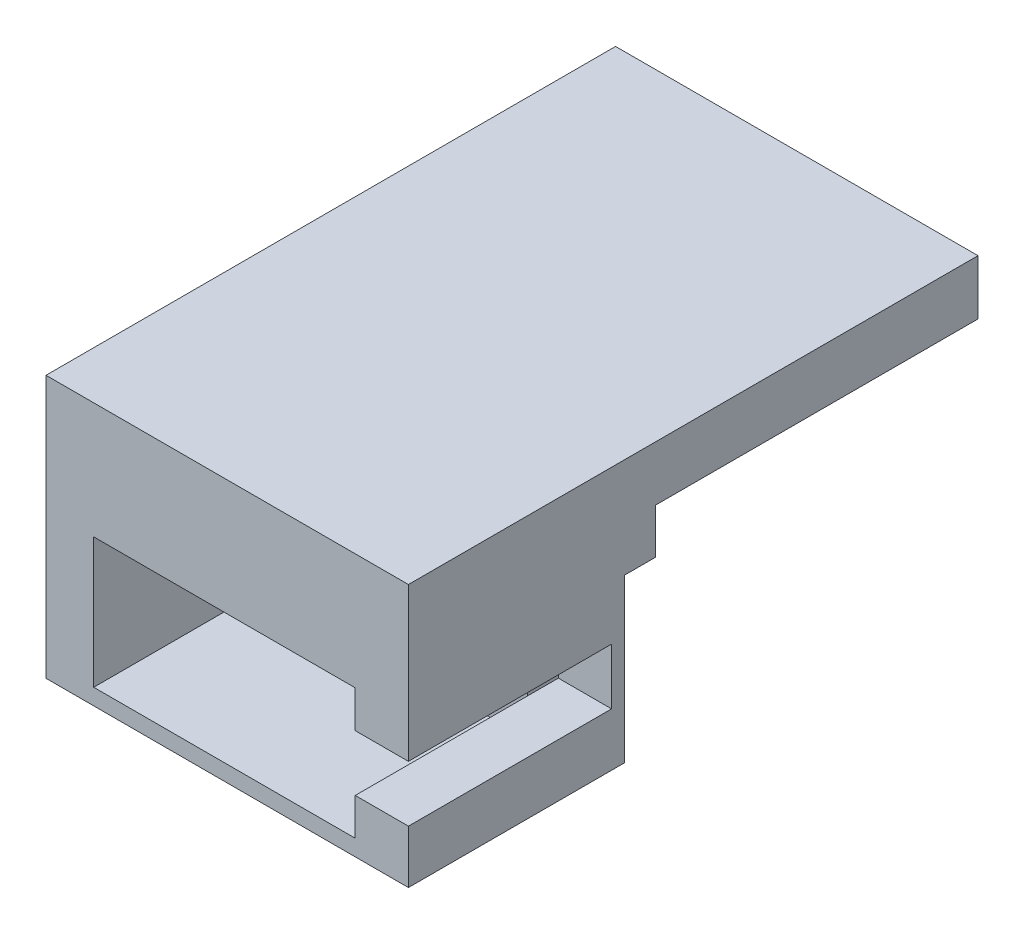
ISO-10303-21;
HEADER;
FILE_DESCRIPTION(('STEP AP214'),'2;1');
FILE_NAME('part.step','',(''),(''),'','','');
FILE_SCHEMA(('AUTOMOTIVE_DESIGN { 1 0 10303 214 1 1 1 1 }'));
ENDSEC;
DATA;
#1=APPLICATION_CONTEXT('core data for automotive mechanical design processes');
#2=APPLICATION_PROTOCOL_DEFINITION('international standard','automotive_design',2000,#1);
#3=PRODUCT_CONTEXT('',#1,'mechanical');
#4=PRODUCT('Part','Part','',(#3));
#5=PRODUCT_RELATED_PRODUCT_CATEGORY('part','',(#4));
#6=PRODUCT_DEFINITION_FORMATION('','',#4);
#7=PRODUCT_DEFINITION_CONTEXT('part definition',#1,'design');
#8=PRODUCT_DEFINITION('design','',#6,#7);
#9=PRODUCT_DEFINITION_SHAPE('','',#8);
#10=(LENGTH_UNIT() NAMED_UNIT(*) SI_UNIT(.MILLI.,.METRE.));
#11=(NAMED_UNIT(*) PLANE_ANGLE_UNIT() SI_UNIT($,.RADIAN.));
#12=(NAMED_UNIT(*) SI_UNIT($,.STERADIAN.) SOLID_ANGLE_UNIT());
#13=UNCERTAINTY_MEASURE_WITH_UNIT(LENGTH_MEASURE(1.E-05),#10,'distance_accuracy_value','');
#14=(GEOMETRIC_REPRESENTATION_CONTEXT(3) GLOBAL_UNCERTAINTY_ASSIGNED_CONTEXT((#13)) GLOBAL_UNIT_ASSIGNED_CONTEXT((#10,
#11,#12)) REPRESENTATION_CONTEXT('',''));
#15=CARTESIAN_POINT('',(0.,0.,0.));
#16=DIRECTION('',(0.,0.,1.));
#17=DIRECTION('',(1.,0.,0.));
#18=AXIS2_PLACEMENT_3D('',#15,#16,#17);
#19=CARTESIAN_POINT('',(-3.38414079582512,-1.3864385582846,31.5));
#20=DIRECTION('',(0.,1.,0.));
#21=DIRECTION('',(-1.,0.,0.));
#22=AXIS2_PLACEMENT_3D('',#19,#20,#21);
#23=PLANE('',#22);
#24=DIRECTION('',(0.,0.,-1.));
#25=VECTOR('',#24,1.);
#26=CARTESIAN_POINT('',(-3.38414079582512,-1.3864385582846,31.5));
#27=LINE('',#26,#25);
#28=CARTESIAN_POINT('',(-3.38414079582512,-1.3864385582846,31.5));
#29=VERTEX_POINT('',#28);
#30=CARTESIAN_POINT('',(-3.38414079582512,-1.3864385582846,-2.));
#31=VERTEX_POINT('',#30);
#32=EDGE_CURVE('E201',#29,#31,#27,.T.);
#33=ORIENTED_EDGE('',*,*,#32,.T.);
#34=DIRECTION('',(1.,0.,0.));
#35=VECTOR('',#34,1.);
#36=CARTESIAN_POINT('',(-3.38414079582512,-1.3864385582846,-2.));
#37=LINE('',#36,#35);
#38=CARTESIAN_POINT('',(52.8158592041749,-1.3864385582846,-2.));
#39=VERTEX_POINT('',#38);
#40=EDGE_CURVE('E285',#31,#39,#37,.T.);
#41=ORIENTED_EDGE('',*,*,#40,.T.);
#42=DIRECTION('',(0.,0.,-1.));
#43=VECTOR('',#42,1.);
#44=CARTESIAN_POINT('',(52.8158592041749,-1.3864385582846,31.5));
#45=LINE('',#44,#43);
#46=CARTESIAN_POINT('',(52.8158592041749,-1.3864385582846,31.5));
#47=VERTEX_POINT('',#46);
#48=EDGE_CURVE('E364',#47,#39,#45,.T.);
#49=ORIENTED_EDGE('',*,*,#48,.F.);
#50=DIRECTION('',(1.,0.,0.));
#51=VECTOR('',#50,1.);
#52=CARTESIAN_POINT('',(-3.38414079582512,-1.3864385582846,31.5));
#53=LINE('',#52,#51);
#54=EDGE_CURVE('E332',#29,#47,#53,.T.);
#55=ORIENTED_EDGE('',*,*,#54,.F.);
#56=EDGE_LOOP('',(#33,#41,#49,#55));
#57=FACE_BOUND('',#56,.T.);
#58=ADVANCED_FACE('F39',(#57),#23,.F.);
#59=CARTESIAN_POINT('',(44.5658592041749,6.8635614417154,31.5));
#60=DIRECTION('',(0.,-1.,0.));
#61=DIRECTION('',(0.,0.,-1.));
#62=AXIS2_PLACEMENT_3D('',#59,#60,#61);
#63=PLANE('',#62);
#64=DIRECTION('',(-1.,0.,0.));
#65=VECTOR('',#64,1.);
#66=CARTESIAN_POINT('',(44.5658592041749,6.8635614417154,0.));
#67=LINE('',#66,#65);
#68=CARTESIAN_POINT('',(52.8158592041749,6.8635614417154,0.));
#69=VERTEX_POINT('',#68);
#70=CARTESIAN_POINT('',(44.5658592041749,6.8635614417154,0.));
#71=VERTEX_POINT('',#70);
#72=EDGE_CURVE('E324',#69,#71,#67,.T.);
#73=ORIENTED_EDGE('',*,*,#72,.T.);
#74=DIRECTION('',(0.,0.,-1.));
#75=VECTOR('',#74,1.);
#76=CARTESIAN_POINT('',(44.5658592041749,6.8635614417154,31.5));
#77=LINE('',#76,#75);
#78=CARTESIAN_POINT('',(44.5658592041749,6.8635614417154,4.8));
#79=VERTEX_POINT('',#78);
#80=EDGE_CURVE('E358',#79,#71,#77,.T.);
#81=ORIENTED_EDGE('',*,*,#80,.F.);
#82=CARTESIAN_POINT('',(44.5658592041749,6.8635614417154,31.5));
#83=VERTEX_POINT('',#82);
#84=EDGE_CURVE('E359',#83,#79,#77,.T.);
#85=ORIENTED_EDGE('',*,*,#84,.F.);
#86=DIRECTION('',(-1.,0.,0.));
#87=VECTOR('',#86,1.);
#88=CARTESIAN_POINT('',(44.5658592041749,6.8635614417154,31.5));
#89=LINE('',#88,#87);
#90=CARTESIAN_POINT('',(52.8158592041749,6.8635614417154,31.5));
#91=VERTEX_POINT('',#90);
#92=EDGE_CURVE('E337',#91,#83,#89,.T.);
#93=ORIENTED_EDGE('',*,*,#92,.F.);
#94=DIRECTION('',(0.,0.,-1.));
#95=VECTOR('',#94,1.);
#96=CARTESIAN_POINT('',(52.8158592041749,6.8635614417154,31.5));
#97=LINE('',#96,#95);
#98=EDGE_CURVE('E361',#91,#69,#97,.T.);
#99=ORIENTED_EDGE('',*,*,#98,.T.);
#100=EDGE_LOOP('',(#73,#81,#85,#93,#99));
#101=FACE_BOUND('',#100,.T.);
#102=ADVANCED_FACE('F411',(#101),#63,.F.);
#103=CARTESIAN_POINT('',(44.5658592041749,15.5635614417154,31.5));
#104=DIRECTION('',(-1.,0.,0.));
#105=DIRECTION('',(0.,0.,1.));
#106=AXIS2_PLACEMENT_3D('',#103,#104,#105);
#107=PLANE('',#106);
#108=DIRECTION('',(0.,0.,-1.));
#109=VECTOR('',#108,1.);
#110=CARTESIAN_POINT('',(44.5658592041749,15.5635614417154,31.5));
#111=LINE('',#110,#109);
#112=CARTESIAN_POINT('',(44.5658592041749,15.5635614417154,4.8));
#113=VERTEX_POINT('',#112);
#114=CARTESIAN_POINT('',(44.5658592041749,15.5635614417154,0.));
#115=VERTEX_POINT('',#114);
#116=EDGE_CURVE('E354',#113,#115,#111,.T.);
#117=ORIENTED_EDGE('',*,*,#116,.F.);
#118=DIRECTION('',(0.,1.,0.));
#119=VECTOR('',#118,1.);
#120=CARTESIAN_POINT('',(44.5658592041749,6.8635614417154,4.8));
#121=LINE('',#120,#119);
#122=EDGE_CURVE('E310',#79,#113,#121,.T.);
#123=ORIENTED_EDGE('',*,*,#122,.F.);
#124=ORIENTED_EDGE('',*,*,#80,.T.);
#125=DIRECTION('',(0.,1.,0.));
#126=VECTOR('',#125,1.);
#127=CARTESIAN_POINT('',(44.5658592041749,15.5635614417154,0.));
#128=LINE('',#127,#126);
#129=EDGE_CURVE('E345',#71,#115,#128,.T.);
#130=ORIENTED_EDGE('',*,*,#129,.T.);
#131=EDGE_LOOP('',(#117,#123,#124,#130));
#132=FACE_BOUND('',#131,.T.);
#133=ADVANCED_FACE('F418',(#132),#107,.F.);
#134=CARTESIAN_POINT('',(52.8158592041749,15.5635614417154,31.5));
#135=DIRECTION('',(0.,1.,0.));
#136=DIRECTION('',(-1.,0.,0.));
#137=AXIS2_PLACEMENT_3D('',#134,#135,#136);
#138=PLANE('',#137);
#139=DIRECTION('',(1.,0.,0.));
#140=VECTOR('',#139,1.);
#141=CARTESIAN_POINT('',(52.8158592041749,15.5635614417154,0.));
#142=LINE('',#141,#140);
#143=CARTESIAN_POINT('',(52.8158592041749,15.5635614417154,0.));
#144=VERTEX_POINT('',#143);
#145=EDGE_CURVE('E335',#115,#144,#142,.T.);
#146=ORIENTED_EDGE('',*,*,#145,.T.);
#147=DIRECTION('',(0.,0.,-1.));
#148=VECTOR('',#147,1.);
#149=CARTESIAN_POINT('',(52.8158592041749,15.5635614417154,31.5));
#150=LINE('',#149,#148);
#151=CARTESIAN_POINT('',(52.8158592041749,15.5635614417154,31.5));
#152=VERTEX_POINT('',#151);
#153=EDGE_CURVE('E351',#152,#144,#150,.T.);
#154=ORIENTED_EDGE('',*,*,#153,.F.);
#155=DIRECTION('',(1.,0.,0.));
#156=VECTOR('',#155,1.);
#157=CARTESIAN_POINT('',(52.8158592041749,15.5635614417154,31.5));
#158=LINE('',#157,#156);
#159=CARTESIAN_POINT('',(44.5658592041749,15.5635614417154,31.5));
#160=VERTEX_POINT('',#159);
#161=EDGE_CURVE('E340',#160,#152,#158,.T.);
#162=ORIENTED_EDGE('',*,*,#161,.F.);
#163=EDGE_CURVE('E355',#160,#113,#111,.T.);
#164=ORIENTED_EDGE('',*,*,#163,.T.);
#165=ORIENTED_EDGE('',*,*,#116,.T.);
#166=EDGE_LOOP('',(#146,#154,#162,#164,#165));
#167=FACE_BOUND('',#166,.T.);
#168=ADVANCED_FACE('F424',(#167),#138,.F.);
#169=CARTESIAN_POINT('',(52.8158592041749,23.8135614417154,31.5));
#170=DIRECTION('',(-1.,0.,0.));
#171=DIRECTION('',(0.,0.,1.));
#172=AXIS2_PLACEMENT_3D('',#169,#170,#171);
#173=PLANE('',#172);
#174=ORIENTED_EDGE('',*,*,#153,.T.);
#175=DIRECTION('',(0.,1.,0.));
#176=VECTOR('',#175,1.);
#177=CARTESIAN_POINT('',(52.8158592041749,-1.3864385582846,0.));
#178=LINE('',#177,#176);
#179=EDGE_CURVE('E284',#69,#144,#178,.T.);
#180=ORIENTED_EDGE('',*,*,#179,.F.);
#181=ORIENTED_EDGE('',*,*,#98,.F.);
#182=DIRECTION('',(0.,1.,0.));
#183=VECTOR('',#182,1.);
#184=CARTESIAN_POINT('',(52.8158592041749,-1.3864385582846,31.5));
#185=LINE('',#184,#183);
#186=EDGE_CURVE('E334',#47,#91,#185,.T.);
#187=ORIENTED_EDGE('',*,*,#186,.F.);
#188=ORIENTED_EDGE('',*,*,#48,.T.);
#189=DIRECTION('',(0.,1.,0.));
#190=VECTOR('',#189,1.);
#191=CARTESIAN_POINT('',(52.8158592041749,-1.3864385582846,-2.));
#192=LINE('',#191,#190);
#193=CARTESIAN_POINT('',(52.8158592041749,23.8135614417154,-2.));
#194=VERTEX_POINT('',#193);
#195=EDGE_CURVE('E288',#39,#194,#192,.T.);
#196=ORIENTED_EDGE('',*,*,#195,.T.);
#197=DIRECTION('',(0.,0.,-1.));
#198=VECTOR('',#197,1.);
#199=CARTESIAN_POINT('',(52.8158592041749,23.8135614417154,13.1788546109846));
#200=LINE('',#199,#198);
#201=CARTESIAN_POINT('',(52.8158592041749,23.8135614417154,-6.82114538901544));
#202=VERTEX_POINT('',#201);
#203=EDGE_CURVE('E276',#194,#202,#200,.T.);
#204=ORIENTED_EDGE('',*,*,#203,.T.);
#205=DIRECTION('',(0.,-1.,0.));
#206=VECTOR('',#205,1.);
#207=CARTESIAN_POINT('',(52.8158592041749,30.8135614417154,-6.82114538901544));
#208=LINE('',#207,#206);
#209=CARTESIAN_POINT('',(52.8158592041749,30.8135614417154,-6.82114538901544));
#210=VERTEX_POINT('',#209);
#211=EDGE_CURVE('E281',#210,#202,#208,.T.);
#212=ORIENTED_EDGE('',*,*,#211,.F.);
#213=DIRECTION('',(0.,0.,-1.));
#214=VECTOR('',#213,1.);
#215=CARTESIAN_POINT('',(52.8158592041749,30.8135614417154,3.17885461098456));
#216=LINE('',#215,#214);
#217=CARTESIAN_POINT('',(52.8158592041749,30.8135614417154,-56.8211453890154));
#218=VERTEX_POINT('',#217);
#219=EDGE_CURVE('E254',#210,#218,#216,.T.);
#220=ORIENTED_EDGE('',*,*,#219,.T.);
#221=DIRECTION('',(0.,-1.,0.));
#222=VECTOR('',#221,1.);
#223=CARTESIAN_POINT('',(52.8158592041749,39.3135614417154,-56.8211453890154));
#224=LINE('',#223,#222);
#225=CARTESIAN_POINT('',(52.8158592041749,39.3135614417154,-56.8211453890154));
#226=VERTEX_POINT('',#225);
#227=EDGE_CURVE('E257',#226,#218,#224,.T.);
#228=ORIENTED_EDGE('',*,*,#227,.F.);
#229=DIRECTION('',(0.,0.,-1.));
#230=VECTOR('',#229,1.);
#231=CARTESIAN_POINT('',(52.8158592041749,39.3135614417154,3.17885461098456));
#232=LINE('',#231,#230);
#233=CARTESIAN_POINT('',(52.8158592041749,39.3135614417154,31.5));
#234=VERTEX_POINT('',#233);
#235=EDGE_CURVE('E215',#234,#226,#232,.T.);
#236=ORIENTED_EDGE('',*,*,#235,.F.);
#237=DIRECTION('',(0.,1.,0.));
#238=VECTOR('',#237,1.);
#239=CARTESIAN_POINT('',(52.8158592041749,23.8135614417154,31.5));
#240=LINE('',#239,#238);
#241=EDGE_CURVE('E206',#152,#234,#240,.T.);
#242=ORIENTED_EDGE('',*,*,#241,.F.);
#243=EDGE_LOOP('',(#174,#180,#181,#187,#188,#196,#204,#212,#220,#228,#236,#242));
#244=FACE_BOUND('',#243,.T.);
#245=ADVANCED_FACE('F428',(#244),#173,.F.);
#246=CARTESIAN_POINT('',(-3.38414079582512,-1.3864385582846,31.5));
#247=DIRECTION('',(1.,0.,0.));
#248=DIRECTION('',(0.,0.,-1.));
#249=AXIS2_PLACEMENT_3D('',#246,#247,#248);
#250=PLANE('',#249);
#251=DIRECTION('',(0.,-1.,0.));
#252=VECTOR('',#251,1.);
#253=CARTESIAN_POINT('',(-3.38414079582512,-1.3864385582846,31.5));
#254=LINE('',#253,#252);
#255=CARTESIAN_POINT('',(-3.38414079582512,39.3135614417154,31.5));
#256=VERTEX_POINT('',#255);
#257=EDGE_CURVE('E194',#256,#29,#254,.T.);
#258=ORIENTED_EDGE('',*,*,#257,.F.);
#259=DIRECTION('',(0.,0.,1.));
#260=VECTOR('',#259,1.);
#261=CARTESIAN_POINT('',(-3.38414079582513,39.3135614417154,-56.8211453890154));
#262=LINE('',#261,#260);
#263=CARTESIAN_POINT('',(-3.38414079582513,39.3135614417154,-56.8211453890154));
#264=VERTEX_POINT('',#263);
#265=EDGE_CURVE('E198',#264,#256,#262,.T.);
#266=ORIENTED_EDGE('',*,*,#265,.F.);
#267=DIRECTION('',(0.,-1.,0.));
#268=VECTOR('',#267,1.);
#269=CARTESIAN_POINT('',(-3.38414079582513,39.3135614417154,-56.8211453890154));
#270=LINE('',#269,#268);
#271=CARTESIAN_POINT('',(-3.38414079582513,30.8135614417154,-56.8211453890154));
#272=VERTEX_POINT('',#271);
#273=EDGE_CURVE('E266',#264,#272,#270,.T.);
#274=ORIENTED_EDGE('',*,*,#273,.T.);
#275=DIRECTION('',(0.,0.,1.));
#276=VECTOR('',#275,1.);
#277=CARTESIAN_POINT('',(-3.38414079582513,30.8135614417154,-56.8211453890154));
#278=LINE('',#277,#276);
#279=CARTESIAN_POINT('',(-3.38414079582512,30.8135614417154,-6.82114538901544));
#280=VERTEX_POINT('',#279);
#281=EDGE_CURVE('E260',#272,#280,#278,.T.);
#282=ORIENTED_EDGE('',*,*,#281,.T.);
#283=DIRECTION('',(0.,-1.,0.));
#284=VECTOR('',#283,1.);
#285=CARTESIAN_POINT('',(-3.38414079582512,30.8135614417154,-6.82114538901544));
#286=LINE('',#285,#284);
#287=CARTESIAN_POINT('',(-3.38414079582512,23.8135614417154,-6.82114538901544));
#288=VERTEX_POINT('',#287);
#289=EDGE_CURVE('E272',#280,#288,#286,.T.);
#290=ORIENTED_EDGE('',*,*,#289,.T.);
#291=DIRECTION('',(0.,0.,1.));
#292=VECTOR('',#291,1.);
#293=CARTESIAN_POINT('',(-3.38414079582512,23.8135614417154,-6.82114538901544));
#294=LINE('',#293,#292);
#295=CARTESIAN_POINT('',(-3.38414079582512,23.8135614417154,-2.));
#296=VERTEX_POINT('',#295);
#297=EDGE_CURVE('E268',#288,#296,#294,.T.);
#298=ORIENTED_EDGE('',*,*,#297,.T.);
#299=DIRECTION('',(0.,-1.,0.));
#300=VECTOR('',#299,1.);
#301=CARTESIAN_POINT('',(-3.38414079582512,23.8135614417154,-2.));
#302=LINE('',#301,#300);
#303=EDGE_CURVE('E294',#296,#31,#302,.T.);
#304=ORIENTED_EDGE('',*,*,#303,.T.);
#305=ORIENTED_EDGE('',*,*,#32,.F.);
#306=EDGE_LOOP('',(#258,#266,#274,#282,#290,#298,#304,#305));
#307=FACE_BOUND('',#306,.T.);
#308=ADVANCED_FACE('F196',(#307),#250,.F.);
#309=CARTESIAN_POINT('',(0.,0.,31.5));
#310=DIRECTION('',(0.,0.,1.));
#311=DIRECTION('',(1.,0.,0.));
#312=AXIS2_PLACEMENT_3D('',#309,#310,#311);
#313=PLANE('',#312);
#314=DIRECTION('',(0.,1.,0.));
#315=VECTOR('',#314,1.);
#316=CARTESIAN_POINT('',(44.5658592041749,0.,31.5));
#317=LINE('',#316,#315);
#318=CARTESIAN_POINT('',(44.5658592041749,21.3135614417154,31.5));
#319=VERTEX_POINT('',#318);
#320=EDGE_CURVE('E366',#160,#319,#317,.T.);
#321=ORIENTED_EDGE('',*,*,#320,.F.);
#322=ORIENTED_EDGE('',*,*,#161,.T.);
#323=ORIENTED_EDGE('',*,*,#241,.T.);
#324=DIRECTION('',(1.,0.,0.));
#325=VECTOR('',#324,1.);
#326=CARTESIAN_POINT('',(-3.38414079582512,39.3135614417154,31.5));
#327=LINE('',#326,#325);
#328=EDGE_CURVE('E211',#256,#234,#327,.T.);
#329=ORIENTED_EDGE('',*,*,#328,.F.);
#330=ORIENTED_EDGE('',*,*,#257,.T.);
#331=ORIENTED_EDGE('',*,*,#54,.T.);
#332=ORIENTED_EDGE('',*,*,#186,.T.);
#333=ORIENTED_EDGE('',*,*,#92,.T.);
#334=DIRECTION('',(0.,1.,0.));
#335=VECTOR('',#334,1.);
#336=CARTESIAN_POINT('',(44.5658592041749,21.3135614417154,31.5));
#337=LINE('',#336,#335);
#338=CARTESIAN_POINT('',(44.5658592041749,1.1135614417154,31.5));
#339=VERTEX_POINT('',#338);
#340=EDGE_CURVE('E318',#339,#83,#337,.T.);
#341=ORIENTED_EDGE('',*,*,#340,.F.);
#342=DIRECTION('',(1.,0.,0.));
#343=VECTOR('',#342,1.);
#344=CARTESIAN_POINT('',(44.5658592041749,1.1135614417154,31.5));
#345=LINE('',#344,#343);
#346=CARTESIAN_POINT('',(4.01585920417488,1.1135614417154,31.5));
#347=VERTEX_POINT('',#346);
#348=EDGE_CURVE('E315',#347,#339,#345,.T.);
#349=ORIENTED_EDGE('',*,*,#348,.F.);
#350=DIRECTION('',(0.,-1.,0.));
#351=VECTOR('',#350,1.);
#352=CARTESIAN_POINT('',(4.01585920417488,1.1135614417154,31.5));
#353=LINE('',#352,#351);
#354=CARTESIAN_POINT('',(4.01585920417488,21.3135614417154,31.5));
#355=VERTEX_POINT('',#354);
#356=EDGE_CURVE('E296',#355,#347,#353,.T.);
#357=ORIENTED_EDGE('',*,*,#356,.F.);
#358=DIRECTION('',(-1.,0.,0.));
#359=VECTOR('',#358,1.);
#360=CARTESIAN_POINT('',(4.01585920417488,21.3135614417154,31.5));
#361=LINE('',#360,#359);
#362=EDGE_CURVE('E302',#319,#355,#361,.T.);
#363=ORIENTED_EDGE('',*,*,#362,.F.);
#364=EDGE_LOOP('',(#321,#322,#323,#329,#330,#331,#332,#333,#341,#349,#357,#363));
#365=FACE_BOUND('',#364,.T.);
#366=ADVANCED_FACE('F218',(#365),#313,.T.);
#367=CARTESIAN_POINT('',(44.5658592041749,21.3135614417154,4.8));
#368=DIRECTION('',(1.,0.,0.));
#369=DIRECTION('',(0.,0.,-1.));
#370=AXIS2_PLACEMENT_3D('',#367,#368,#369);
#371=PLANE('',#370);
#372=CARTESIAN_POINT('',(44.5658592041749,1.1135614417154,4.8));
#373=VERTEX_POINT('',#372);
#374=EDGE_CURVE('E306',#373,#79,#121,.T.);
#375=ORIENTED_EDGE('',*,*,#374,.F.);
#376=DIRECTION('',(0.,0.,1.));
#377=VECTOR('',#376,1.);
#378=CARTESIAN_POINT('',(44.5658592041749,1.1135614417154,4.8));
#379=LINE('',#378,#377);
#380=EDGE_CURVE('E328',#373,#339,#379,.T.);
#381=ORIENTED_EDGE('',*,*,#380,.T.);
#382=ORIENTED_EDGE('',*,*,#340,.T.);
#383=ORIENTED_EDGE('',*,*,#84,.T.);
#384=EDGE_LOOP('',(#375,#381,#382,#383));
#385=FACE_BOUND('',#384,.T.);
#386=ADVANCED_FACE('F437',(#385),#371,.F.);
#387=ORIENTED_EDGE('',*,*,#320,.T.);
#388=DIRECTION('',(0.,0.,1.));
#389=VECTOR('',#388,1.);
#390=CARTESIAN_POINT('',(44.5658592041749,21.3135614417154,4.8));
#391=LINE('',#390,#389);
#392=CARTESIAN_POINT('',(44.5658592041749,21.3135614417154,4.8));
#393=VERTEX_POINT('',#392);
#394=EDGE_CURVE('E325',#393,#319,#391,.T.);
#395=ORIENTED_EDGE('',*,*,#394,.F.);
#396=EDGE_CURVE('E305',#113,#393,#121,.T.);
#397=ORIENTED_EDGE('',*,*,#396,.F.);
#398=ORIENTED_EDGE('',*,*,#163,.F.);
#399=EDGE_LOOP('',(#387,#395,#397,#398));
#400=FACE_BOUND('',#399,.T.);
#401=ADVANCED_FACE('F442',(#400),#371,.F.);
#402=CARTESIAN_POINT('',(4.01585920417488,1.1135614417154,4.8));
#403=DIRECTION('',(-1.,0.,0.));
#404=DIRECTION('',(0.,-1.,0.));
#405=AXIS2_PLACEMENT_3D('',#402,#403,#404);
#406=PLANE('',#405);
#407=ORIENTED_EDGE('',*,*,#356,.T.);
#408=DIRECTION('',(0.,0.,1.));
#409=VECTOR('',#408,1.);
#410=CARTESIAN_POINT('',(4.01585920417488,1.1135614417154,4.8));
#411=LINE('',#410,#409);
#412=CARTESIAN_POINT('',(4.01585920417488,1.1135614417154,4.8));
#413=VERTEX_POINT('',#412);
#414=EDGE_CURVE('E313',#413,#347,#411,.T.);
#415=ORIENTED_EDGE('',*,*,#414,.F.);
#416=DIRECTION('',(0.,-1.,0.));
#417=VECTOR('',#416,1.);
#418=CARTESIAN_POINT('',(4.01585920417488,1.1135614417154,4.8));
#419=LINE('',#418,#417);
#420=CARTESIAN_POINT('',(4.01585920417488,21.3135614417154,4.8));
#421=VERTEX_POINT('',#420);
#422=EDGE_CURVE('E298',#421,#413,#419,.T.);
#423=ORIENTED_EDGE('',*,*,#422,.F.);
#424=DIRECTION('',(0.,0.,1.));
#425=VECTOR('',#424,1.);
#426=CARTESIAN_POINT('',(4.01585920417488,21.3135614417154,4.8));
#427=LINE('',#426,#425);
#428=EDGE_CURVE('E322',#421,#355,#427,.T.);
#429=ORIENTED_EDGE('',*,*,#428,.T.);
#430=EDGE_LOOP('',(#407,#415,#423,#429));
#431=FACE_BOUND('',#430,.T.);
#432=ADVANCED_FACE('F438',(#431),#406,.F.);
#433=CARTESIAN_POINT('',(4.01585920417488,21.3135614417154,4.8));
#434=DIRECTION('',(0.,1.,0.));
#435=DIRECTION('',(0.,0.,1.));
#436=AXIS2_PLACEMENT_3D('',#433,#434,#435);
#437=PLANE('',#436);
#438=ORIENTED_EDGE('',*,*,#362,.T.);
#439=ORIENTED_EDGE('',*,*,#428,.F.);
#440=DIRECTION('',(-1.,0.,0.));
#441=VECTOR('',#440,1.);
#442=CARTESIAN_POINT('',(4.01585920417488,21.3135614417154,4.8));
#443=LINE('',#442,#441);
#444=EDGE_CURVE('E309',#393,#421,#443,.T.);
#445=ORIENTED_EDGE('',*,*,#444,.F.);
#446=ORIENTED_EDGE('',*,*,#394,.T.);
#447=EDGE_LOOP('',(#438,#439,#445,#446));
#448=FACE_BOUND('',#447,.T.);
#449=ADVANCED_FACE('F441',(#448),#437,.F.);
#450=CARTESIAN_POINT('',(44.5658592041749,1.1135614417154,4.8));
#451=DIRECTION('',(0.,-1.,0.));
#452=DIRECTION('',(1.,0.,0.));
#453=AXIS2_PLACEMENT_3D('',#450,#451,#452);
#454=PLANE('',#453);
#455=ORIENTED_EDGE('',*,*,#348,.T.);
#456=ORIENTED_EDGE('',*,*,#380,.F.);
#457=DIRECTION('',(1.,0.,0.));
#458=VECTOR('',#457,1.);
#459=CARTESIAN_POINT('',(44.5658592041749,1.1135614417154,4.8));
#460=LINE('',#459,#458);
#461=EDGE_CURVE('E301',#413,#373,#460,.T.);
#462=ORIENTED_EDGE('',*,*,#461,.F.);
#463=ORIENTED_EDGE('',*,*,#414,.T.);
#464=EDGE_LOOP('',(#455,#456,#462,#463));
#465=FACE_BOUND('',#464,.T.);
#466=ADVANCED_FACE('F444',(#465),#454,.F.);
#467=CARTESIAN_POINT('',(0.,0.,4.8));
#468=DIRECTION('',(0.,0.,-1.));
#469=DIRECTION('',(-1.,0.,0.));
#470=AXIS2_PLACEMENT_3D('',#467,#468,#469);
#471=PLANE('',#470);
#472=ORIENTED_EDGE('',*,*,#422,.T.);
#473=ORIENTED_EDGE('',*,*,#461,.T.);
#474=ORIENTED_EDGE('',*,*,#374,.T.);
#475=ORIENTED_EDGE('',*,*,#122,.T.);
#476=ORIENTED_EDGE('',*,*,#396,.T.);
#477=ORIENTED_EDGE('',*,*,#444,.T.);
#478=EDGE_LOOP('',(#472,#473,#474,#475,#476,#477));
#479=FACE_BOUND('',#478,.T.);
#480=ADVANCED_FACE('F447',(#479),#471,.F.);
#481=CARTESIAN_POINT('',(0.,0.,0.));
#482=DIRECTION('',(0.,0.,1.));
#483=DIRECTION('',(1.,0.,0.));
#484=AXIS2_PLACEMENT_3D('',#481,#482,#483);
#485=PLANE('',#484);
#486=ORIENTED_EDGE('',*,*,#145,.F.);
#487=ORIENTED_EDGE('',*,*,#129,.F.);
#488=ORIENTED_EDGE('',*,*,#72,.F.);
#489=ORIENTED_EDGE('',*,*,#179,.T.);
#490=EDGE_LOOP('',(#486,#487,#488,#489));
#491=FACE_BOUND('',#490,.T.);
#492=ADVANCED_FACE('F456',(#491),#485,.T.);
#493=CARTESIAN_POINT('',(0.,0.,-2.));
#494=DIRECTION('',(0.,0.,1.));
#495=DIRECTION('',(1.,0.,0.));
#496=AXIS2_PLACEMENT_3D('',#493,#494,#495);
#497=PLANE('',#496);
#498=ORIENTED_EDGE('',*,*,#40,.F.);
#499=ORIENTED_EDGE('',*,*,#303,.F.);
#500=DIRECTION('',(-1.,0.,0.));
#501=VECTOR('',#500,1.);
#502=CARTESIAN_POINT('',(52.8158592041749,23.8135614417154,-2.));
#503=LINE('',#502,#501);
#504=EDGE_CURVE('E291',#194,#296,#503,.T.);
#505=ORIENTED_EDGE('',*,*,#504,.F.);
#506=ORIENTED_EDGE('',*,*,#195,.F.);
#507=EDGE_LOOP('',(#498,#499,#505,#506));
#508=FACE_BOUND('',#507,.T.);
#509=ADVANCED_FACE('F460',(#508),#497,.F.);
#510=CARTESIAN_POINT('',(0.,23.8135614417154,0.));
#511=DIRECTION('',(0.,1.,0.));
#512=DIRECTION('',(0.,0.,1.));
#513=AXIS2_PLACEMENT_3D('',#510,#511,#512);
#514=PLANE('',#513);
#515=ORIENTED_EDGE('',*,*,#203,.F.);
#516=ORIENTED_EDGE('',*,*,#504,.T.);
#517=ORIENTED_EDGE('',*,*,#297,.F.);
#518=DIRECTION('',(-1.,0.,0.));
#519=VECTOR('',#518,1.);
#520=CARTESIAN_POINT('',(52.8158592041749,23.8135614417154,-6.82114538901544));
#521=LINE('',#520,#519);
#522=EDGE_CURVE('E273',#202,#288,#521,.T.);
#523=ORIENTED_EDGE('',*,*,#522,.F.);
#524=EDGE_LOOP('',(#515,#516,#517,#523));
#525=FACE_BOUND('',#524,.T.);
#526=ADVANCED_FACE('F464',(#525),#514,.F.);
#527=CARTESIAN_POINT('',(52.8158592041749,30.8135614417154,-6.82114538901544));
#528=DIRECTION('',(0.,0.,1.));
#529=DIRECTION('',(1.,0.,0.));
#530=AXIS2_PLACEMENT_3D('',#527,#528,#529);
#531=PLANE('',#530);
#532=ORIENTED_EDGE('',*,*,#522,.T.);
#533=ORIENTED_EDGE('',*,*,#289,.F.);
#534=DIRECTION('',(-1.,0.,0.));
#535=VECTOR('',#534,1.);
#536=CARTESIAN_POINT('',(52.8158592041749,30.8135614417154,-6.82114538901544));
#537=LINE('',#536,#535);
#538=EDGE_CURVE('E269',#210,#280,#537,.T.);
#539=ORIENTED_EDGE('',*,*,#538,.F.);
#540=ORIENTED_EDGE('',*,*,#211,.T.);
#541=EDGE_LOOP('',(#532,#533,#539,#540));
#542=FACE_BOUND('',#541,.T.);
#543=ADVANCED_FACE('F466',(#542),#531,.F.);
#544=CARTESIAN_POINT('',(0.,30.8135614417154,0.));
#545=DIRECTION('',(0.,1.,0.));
#546=DIRECTION('',(0.,0.,1.));
#547=AXIS2_PLACEMENT_3D('',#544,#545,#546);
#548=PLANE('',#547);
#549=CARTESIAN_POINT('',(22.3405072549363,30.8135614417154,-44.7479400444345));
#550=DIRECTION('',(0.,-1.,0.));
#551=DIRECTION('',(0.,0.,-1.));
#552=AXIS2_PLACEMENT_3D('',#549,#550,#551);
#553=CIRCLE('',#552,7.6);
#554=CARTESIAN_POINT('',(27.7797912177125,30.8135614417154,-39.440003536498));
#555=VERTEX_POINT('',#554);
#556=CARTESIAN_POINT('',(27.7797912177125,30.8135614417154,-50.055876552371));
#557=VERTEX_POINT('',#556);
#558=EDGE_CURVE('E228',#555,#557,#553,.T.);
#559=ORIENTED_EDGE('',*,*,#558,.F.);
#560=CARTESIAN_POINT('',(31.3582675090127,30.8135614417154,-35.9479400444345));
#561=DIRECTION('',(0.,1.,0.));
#562=DIRECTION('',(0.,0.,1.));
#563=AXIS2_PLACEMENT_3D('',#560,#561,#562);
#564=CIRCLE('',#563,5.);
#565=CARTESIAN_POINT('',(31.3582675090127,30.8135614417154,-40.9479400444345));
#566=VERTEX_POINT('',#565);
#567=EDGE_CURVE('E375',#555,#566,#564,.F.);
#568=ORIENTED_EDGE('',*,*,#567,.T.);
#569=DIRECTION('',(-1.,0.,0.));
#570=VECTOR('',#569,1.);
#571=CARTESIAN_POINT('',(28.922300323698,30.8135614417154,-40.9479400444345));
#572=LINE('',#571,#570);
#573=CARTESIAN_POINT('',(45.722300323698,30.8135614417154,-40.9479400444345));
#574=VERTEX_POINT('',#573);
#575=EDGE_CURVE('E233',#574,#566,#572,.T.);
#576=ORIENTED_EDGE('',*,*,#575,.F.);
#577=CARTESIAN_POINT('',(45.722300323698,30.8135614417154,-44.7479400444345));
#578=DIRECTION('',(0.,-1.,0.));
#579=DIRECTION('',(0.,0.,1.));
#580=AXIS2_PLACEMENT_3D('',#577,#578,#579);
#581=CIRCLE('',#580,3.8);
#582=CARTESIAN_POINT('',(45.722300323698,30.8135614417154,-48.5479400444345));
#583=VERTEX_POINT('',#582);
#584=EDGE_CURVE('E245',#583,#574,#581,.T.);
#585=ORIENTED_EDGE('',*,*,#584,.F.);
#586=DIRECTION('',(1.,0.,0.));
#587=VECTOR('',#586,1.);
#588=CARTESIAN_POINT('',(28.922300323698,30.8135614417154,-48.5479400444345));
#589=LINE('',#588,#587);
#590=CARTESIAN_POINT('',(31.3582675090127,30.8135614417154,-48.5479400444345));
#591=VERTEX_POINT('',#590);
#592=EDGE_CURVE('E243',#591,#583,#589,.T.);
#593=ORIENTED_EDGE('',*,*,#592,.F.);
#594=CARTESIAN_POINT('',(31.3582675090127,30.8135614417154,-53.5479400444345));
#595=DIRECTION('',(0.,1.,0.));
#596=DIRECTION('',(0.,0.,1.));
#597=AXIS2_PLACEMENT_3D('',#594,#595,#596);
#598=CIRCLE('',#597,5.);
#599=EDGE_CURVE('E373',#591,#557,#598,.F.);
#600=ORIENTED_EDGE('',*,*,#599,.T.);
#601=EDGE_LOOP('',(#559,#568,#576,#585,#593,#600));
#602=FACE_BOUND('',#601,.T.);
#603=ORIENTED_EDGE('',*,*,#219,.F.);
#604=ORIENTED_EDGE('',*,*,#538,.T.);
#605=ORIENTED_EDGE('',*,*,#281,.F.);
#606=DIRECTION('',(-1.,0.,0.));
#607=VECTOR('',#606,1.);
#608=CARTESIAN_POINT('',(52.8158592041749,30.8135614417154,-56.8211453890154));
#609=LINE('',#608,#607);
#610=EDGE_CURVE('E251',#218,#272,#609,.T.);
#611=ORIENTED_EDGE('',*,*,#610,.F.);
#612=EDGE_LOOP('',(#603,#604,#605,#611));
#613=FACE_BOUND('',#612,.T.);
#614=ADVANCED_FACE('F392',(#602,#613),#548,.F.);
#615=CARTESIAN_POINT('',(52.8158592041749,39.3135614417154,-56.8211453890154));
#616=DIRECTION('',(0.,0.,1.));
#617=DIRECTION('',(1.,0.,0.));
#618=AXIS2_PLACEMENT_3D('',#615,#616,#617);
#619=PLANE('',#618);
#620=ORIENTED_EDGE('',*,*,#610,.T.);
#621=ORIENTED_EDGE('',*,*,#273,.F.);
#622=DIRECTION('',(-1.,0.,0.));
#623=VECTOR('',#622,1.);
#624=CARTESIAN_POINT('',(52.8158592041749,39.3135614417154,-56.8211453890154));
#625=LINE('',#624,#623);
#626=EDGE_CURVE('E213',#226,#264,#625,.T.);
#627=ORIENTED_EDGE('',*,*,#626,.F.);
#628=ORIENTED_EDGE('',*,*,#227,.T.);
#629=EDGE_LOOP('',(#620,#621,#627,#628));
#630=FACE_BOUND('',#629,.T.);
#631=ADVANCED_FACE('F473',(#630),#619,.F.);
#632=CARTESIAN_POINT('',(0.,39.3135614417154,0.));
#633=DIRECTION('',(0.,1.,0.));
#634=DIRECTION('',(0.,0.,1.));
#635=AXIS2_PLACEMENT_3D('',#632,#633,#634);
#636=PLANE('',#635);
#637=ORIENTED_EDGE('',*,*,#626,.T.);
#638=ORIENTED_EDGE('',*,*,#265,.T.);
#639=ORIENTED_EDGE('',*,*,#328,.T.);
#640=ORIENTED_EDGE('',*,*,#235,.T.);
#641=EDGE_LOOP('',(#637,#638,#639,#640));
#642=FACE_BOUND('',#641,.T.);
#643=ADVANCED_FACE('F210',(#642),#636,.T.);
#644=CARTESIAN_POINT('',(22.3405072549363,36.3135614417154,-44.7479400444345));
#645=DIRECTION('',(0.,-1.,0.));
#646=DIRECTION('',(0.,0.,-1.));
#647=AXIS2_PLACEMENT_3D('',#644,#645,#646);
#648=CYLINDRICAL_SURFACE('',#647,7.6);
#649=CARTESIAN_POINT('',(22.3405072549363,36.3135614417154,-44.7479400444345));
#650=DIRECTION('',(0.,-1.,0.));
#651=DIRECTION('',(0.,0.,-1.));
#652=AXIS2_PLACEMENT_3D('',#649,#650,#651);
#653=CIRCLE('',#652,7.6);
#654=CARTESIAN_POINT('',(27.7797912177125,36.3135614417154,-39.440003536498));
#655=VERTEX_POINT('',#654);
#656=CARTESIAN_POINT('',(27.7797912177125,36.3135614417154,-50.055876552371));
#657=VERTEX_POINT('',#656);
#658=EDGE_CURVE('E230',#655,#657,#653,.T.);
#659=ORIENTED_EDGE('',*,*,#658,.F.);
#660=DIRECTION('',(0.,-1.,0.));
#661=VECTOR('',#660,1.);
#662=CARTESIAN_POINT('',(27.7797912177125,36.3135614417154,-39.440003536498));
#663=LINE('',#662,#661);
#664=EDGE_CURVE('E370',#655,#555,#663,.T.);
#665=ORIENTED_EDGE('',*,*,#664,.T.);
#666=ORIENTED_EDGE('',*,*,#558,.T.);
#667=DIRECTION('',(0.,-1.,0.));
#668=VECTOR('',#667,1.);
#669=CARTESIAN_POINT('',(27.7797912177125,36.3135614417154,-50.055876552371));
#670=LINE('',#669,#668);
#671=EDGE_CURVE('E368',#557,#657,#670,.F.);
#672=ORIENTED_EDGE('',*,*,#671,.T.);
#673=EDGE_LOOP('',(#659,#665,#666,#672));
#674=FACE_BOUND('',#673,.T.);
#675=ADVANCED_FACE('F386',(#674),#648,.F.);
#676=CARTESIAN_POINT('',(28.922300323698,36.3135614417154,-40.9479400444345));
#677=DIRECTION('',(0.,0.,1.));
#678=DIRECTION('',(1.,0.,0.));
#679=AXIS2_PLACEMENT_3D('',#676,#677,#678);
#680=PLANE('',#679);
#681=ORIENTED_EDGE('',*,*,#575,.T.);
#682=DIRECTION('',(0.,-1.,0.));
#683=VECTOR('',#682,1.);
#684=CARTESIAN_POINT('',(31.3582675090127,36.3135614417154,-40.9479400444345));
#685=LINE('',#684,#683);
#686=CARTESIAN_POINT('',(31.3582675090127,36.3135614417154,-40.9479400444345));
#687=VERTEX_POINT('',#686);
#688=EDGE_CURVE('E60',#566,#687,#685,.F.);
#689=ORIENTED_EDGE('',*,*,#688,.T.);
#690=DIRECTION('',(-1.,0.,0.));
#691=VECTOR('',#690,1.);
#692=CARTESIAN_POINT('',(28.922300323698,36.3135614417154,-40.9479400444345));
#693=LINE('',#692,#691);
#694=CARTESIAN_POINT('',(45.722300323698,36.3135614417154,-40.9479400444345));
#695=VERTEX_POINT('',#694);
#696=EDGE_CURVE('E238',#695,#687,#693,.T.);
#697=ORIENTED_EDGE('',*,*,#696,.F.);
#698=DIRECTION('',(0.,-1.,0.));
#699=VECTOR('',#698,1.);
#700=CARTESIAN_POINT('',(45.722300323698,36.3135614417154,-40.9479400444345));
#701=LINE('',#700,#699);
#702=EDGE_CURVE('E249',#695,#574,#701,.T.);
#703=ORIENTED_EDGE('',*,*,#702,.T.);
#704=EDGE_LOOP('',(#681,#689,#697,#703));
#705=FACE_BOUND('',#704,.T.);
#706=ADVANCED_FACE('F395',(#705),#680,.F.);
#707=CARTESIAN_POINT('',(45.722300323698,36.3135614417154,-44.7479400444345));
#708=DIRECTION('',(0.,-1.,0.));
#709=DIRECTION('',(0.,0.,-1.));
#710=AXIS2_PLACEMENT_3D('',#707,#708,#709);
#711=CYLINDRICAL_SURFACE('',#710,3.8);
#712=ORIENTED_EDGE('',*,*,#584,.T.);
#713=ORIENTED_EDGE('',*,*,#702,.F.);
#714=CARTESIAN_POINT('',(45.722300323698,36.3135614417154,-44.7479400444345));
#715=DIRECTION('',(0.,-1.,0.));
#716=DIRECTION('',(0.,0.,1.));
#717=AXIS2_PLACEMENT_3D('',#714,#715,#716);
#718=CIRCLE('',#717,3.8);
#719=CARTESIAN_POINT('',(45.722300323698,36.3135614417154,-48.5479400444345));
#720=VERTEX_POINT('',#719);
#721=EDGE_CURVE('E235',#720,#695,#718,.T.);
#722=ORIENTED_EDGE('',*,*,#721,.F.);
#723=DIRECTION('',(0.,-1.,0.));
#724=VECTOR('',#723,1.);
#725=CARTESIAN_POINT('',(45.722300323698,36.3135614417154,-48.5479400444345));
#726=LINE('',#725,#724);
#727=EDGE_CURVE('E240',#720,#583,#726,.T.);
#728=ORIENTED_EDGE('',*,*,#727,.T.);
#729=EDGE_LOOP('',(#712,#713,#722,#728));
#730=FACE_BOUND('',#729,.T.);
#731=ADVANCED_FACE('F398',(#730),#711,.F.);
#732=CARTESIAN_POINT('',(28.922300323698,36.3135614417154,-48.5479400444345));
#733=DIRECTION('',(0.,0.,-1.));
#734=DIRECTION('',(-1.,0.,0.));
#735=AXIS2_PLACEMENT_3D('',#732,#733,#734);
#736=PLANE('',#735);
#737=DIRECTION('',(1.,0.,0.));
#738=VECTOR('',#737,1.);
#739=CARTESIAN_POINT('',(28.922300323698,36.3135614417154,-48.5479400444345));
#740=LINE('',#739,#738);
#741=CARTESIAN_POINT('',(31.3582675090127,36.3135614417154,-48.5479400444345));
#742=VERTEX_POINT('',#741);
#743=EDGE_CURVE('E232',#742,#720,#740,.T.);
#744=ORIENTED_EDGE('',*,*,#743,.F.);
#745=DIRECTION('',(0.,-1.,0.));
#746=VECTOR('',#745,1.);
#747=CARTESIAN_POINT('',(31.3582675090127,36.3135614417154,-48.5479400444345));
#748=LINE('',#747,#746);
#749=EDGE_CURVE('E378',#742,#591,#748,.T.);
#750=ORIENTED_EDGE('',*,*,#749,.T.);
#751=ORIENTED_EDGE('',*,*,#592,.T.);
#752=ORIENTED_EDGE('',*,*,#727,.F.);
#753=EDGE_LOOP('',(#744,#750,#751,#752));
#754=FACE_BOUND('',#753,.T.);
#755=ADVANCED_FACE('F402',(#754),#736,.F.);
#756=CARTESIAN_POINT('',(22.3405072549363,36.3135614417154,-44.7479400444345));
#757=DIRECTION('',(0.,-1.,0.));
#758=DIRECTION('',(0.,0.,-1.));
#759=AXIS2_PLACEMENT_3D('',#756,#757,#758);
#760=PLANE('',#759);
#761=CARTESIAN_POINT('',(22.3405072549363,36.3135614417154,-44.7479400444345));
#762=DIRECTION('',(0.,-1.,0.));
#763=DIRECTION('',(0.,0.,-1.));
#764=AXIS2_PLACEMENT_3D('',#761,#762,#763);
#765=CIRCLE('',#764,2.32571442998826);
#766=CARTESIAN_POINT('',(22.3405072549363,36.3135614417154,-47.0736544744227));
#767=VERTEX_POINT('',#766);
#768=EDGE_CURVE('E221',#767,#767,#765,.T.);
#769=ORIENTED_EDGE('',*,*,#768,.F.);
#770=EDGE_LOOP('',(#769));
#771=FACE_BOUND('',#770,.T.);
#772=ORIENTED_EDGE('',*,*,#696,.T.);
#773=CARTESIAN_POINT('',(31.3582675090127,36.3135614417154,-35.9479400444345));
#774=DIRECTION('',(0.,-1.,0.));
#775=DIRECTION('',(0.,0.,-1.));
#776=AXIS2_PLACEMENT_3D('',#773,#774,#775);
#777=CIRCLE('',#776,5.);
#778=EDGE_CURVE('E47',#687,#655,#777,.F.);
#779=ORIENTED_EDGE('',*,*,#778,.T.);
#780=ORIENTED_EDGE('',*,*,#658,.T.);
#781=CARTESIAN_POINT('',(31.3582675090127,36.3135614417154,-53.5479400444345));
#782=DIRECTION('',(0.,-1.,0.));
#783=DIRECTION('',(0.,0.,-1.));
#784=AXIS2_PLACEMENT_3D('',#781,#782,#783);
#785=CIRCLE('',#784,5.);
#786=EDGE_CURVE('E11',#657,#742,#785,.F.);
#787=ORIENTED_EDGE('',*,*,#786,.T.);
#788=ORIENTED_EDGE('',*,*,#743,.T.);
#789=ORIENTED_EDGE('',*,*,#721,.T.);
#790=EDGE_LOOP('',(#772,#779,#780,#787,#788,#789));
#791=FACE_BOUND('',#790,.T.);
#792=ADVANCED_FACE('F382',(#771,#791),#760,.T.);
#793=CARTESIAN_POINT('',(22.3405072549363,36.8135614417154,-44.7479400444345));
#794=DIRECTION('',(0.,-1.,0.));
#795=DIRECTION('',(0.,0.,-1.));
#796=AXIS2_PLACEMENT_3D('',#793,#794,#795);
#797=CYLINDRICAL_SURFACE('',#796,2.32571442998826);
#798=CARTESIAN_POINT('',(22.3405072549363,36.8135614417154,-44.7479400444345));
#799=DIRECTION('',(0.,-1.,0.));
#800=DIRECTION('',(0.,0.,-1.));
#801=AXIS2_PLACEMENT_3D('',#798,#799,#800);
#802=CIRCLE('',#801,2.32571442998826);
#803=CARTESIAN_POINT('',(22.3405072549363,36.8135614417154,-47.0736544744227));
#804=VERTEX_POINT('',#803);
#805=EDGE_CURVE('E224',#804,#804,#802,.T.);
#806=ORIENTED_EDGE('',*,*,#805,.F.);
#807=EDGE_LOOP('',(#806));
#808=FACE_BOUND('',#807,.T.);
#809=ORIENTED_EDGE('',*,*,#768,.T.);
#810=EDGE_LOOP('',(#809));
#811=FACE_BOUND('',#810,.T.);
#812=ADVANCED_FACE('F491',(#808,#811),#797,.F.);
#813=CARTESIAN_POINT('',(22.3405072549363,36.8135614417154,-44.7479400444345));
#814=DIRECTION('',(0.,-1.,0.));
#815=DIRECTION('',(0.,0.,-1.));
#816=AXIS2_PLACEMENT_3D('',#813,#814,#815);
#817=PLANE('',#816);
#818=ORIENTED_EDGE('',*,*,#805,.T.);
#819=EDGE_LOOP('',(#818));
#820=FACE_BOUND('',#819,.T.);
#821=ADVANCED_FACE('F409',(#820),#817,.T.);
#822=CARTESIAN_POINT('',(31.3582675090127,36.3135614417154,-35.9479400444345));
#823=DIRECTION('',(0.,-1.,0.));
#824=DIRECTION('',(0.,0.,-1.));
#825=AXIS2_PLACEMENT_3D('',#822,#823,#824);
#826=CYLINDRICAL_SURFACE('',#825,5.);
#827=ORIENTED_EDGE('',*,*,#778,.F.);
#828=ORIENTED_EDGE('',*,*,#688,.F.);
#829=ORIENTED_EDGE('',*,*,#567,.F.);
#830=ORIENTED_EDGE('',*,*,#664,.F.);
#831=EDGE_LOOP('',(#827,#828,#829,#830));
#832=FACE_BOUND('',#831,.T.);
#833=ADVANCED_FACE('F389',(#832),#826,.T.);
#834=CARTESIAN_POINT('',(31.3582675090127,36.3135614417154,-53.5479400444345));
#835=DIRECTION('',(0.,-1.,0.));
#836=DIRECTION('',(0.,0.,-1.));
#837=AXIS2_PLACEMENT_3D('',#834,#835,#836);
#838=CYLINDRICAL_SURFACE('',#837,5.);
#839=ORIENTED_EDGE('',*,*,#786,.F.);
#840=ORIENTED_EDGE('',*,*,#671,.F.);
#841=ORIENTED_EDGE('',*,*,#599,.F.);
#842=ORIENTED_EDGE('',*,*,#749,.F.);
#843=EDGE_LOOP('',(#839,#840,#841,#842));
#844=FACE_BOUND('',#843,.T.);
#845=ADVANCED_FACE('F41',(#844),#838,.T.);
#846=CLOSED_SHELL('',(#58,#102,#133,#168,#245,#308,#366,#386,#401,#432,#449,#466,#480,#492,#509,
#526,#543,#614,#631,#643,#675,#706,#731,#755,#792,#812,#821,#833,#845));
#847=MANIFOLD_SOLID_BREP('B2',#846);
#848=ADVANCED_BREP_SHAPE_REPRESENTATION('',(#18,#847),#14);
#849=SHAPE_DEFINITION_REPRESENTATION(#9,#848);
ENDSEC;
END-ISO-10303-21;
